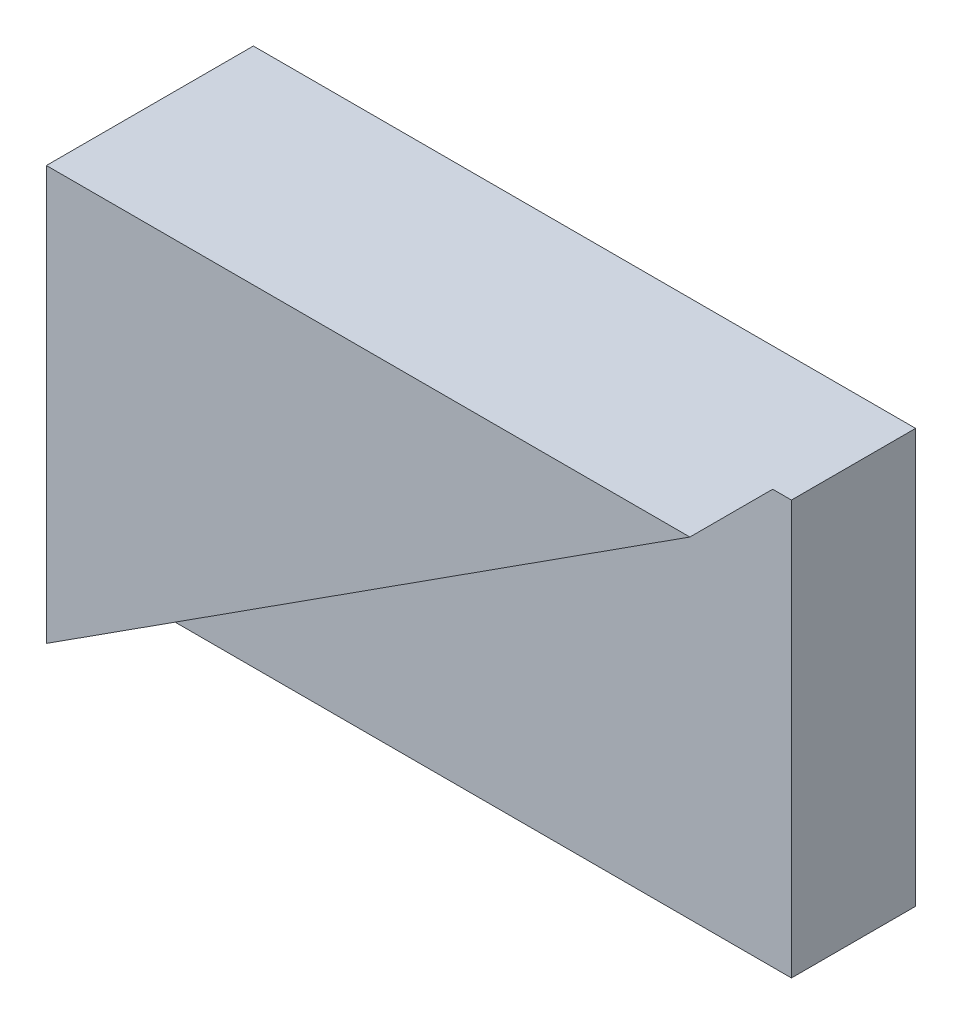
ISO-10303-21;
HEADER;
FILE_DESCRIPTION(('STEP AP214'),'2;1');
FILE_NAME('part.step','',(''),(''),'','','');
FILE_SCHEMA(('AUTOMOTIVE_DESIGN { 1 0 10303 214 1 1 1 1 }'));
ENDSEC;
DATA;
#1=APPLICATION_CONTEXT('core data for automotive mechanical design processes');
#2=APPLICATION_PROTOCOL_DEFINITION('international standard','automotive_design',2000,#1);
#3=PRODUCT_CONTEXT('',#1,'mechanical');
#4=PRODUCT('Part','Part','',(#3));
#5=PRODUCT_RELATED_PRODUCT_CATEGORY('part','',(#4));
#6=PRODUCT_DEFINITION_FORMATION('','',#4);
#7=PRODUCT_DEFINITION_CONTEXT('part definition',#1,'design');
#8=PRODUCT_DEFINITION('design','',#6,#7);
#9=PRODUCT_DEFINITION_SHAPE('','',#8);
#10=(LENGTH_UNIT() NAMED_UNIT(*) SI_UNIT(.MILLI.,.METRE.));
#11=(NAMED_UNIT(*) PLANE_ANGLE_UNIT() SI_UNIT($,.RADIAN.));
#12=(NAMED_UNIT(*) SI_UNIT($,.STERADIAN.) SOLID_ANGLE_UNIT());
#13=UNCERTAINTY_MEASURE_WITH_UNIT(LENGTH_MEASURE(1.E-05),#10,'distance_accuracy_value','');
#14=(GEOMETRIC_REPRESENTATION_CONTEXT(3) GLOBAL_UNCERTAINTY_ASSIGNED_CONTEXT((#13)) GLOBAL_UNIT_ASSIGNED_CONTEXT((#10,
#11,#12)) REPRESENTATION_CONTEXT('',''));
#15=CARTESIAN_POINT('',(0.,0.,0.));
#16=DIRECTION('',(0.,0.,1.));
#17=DIRECTION('',(1.,0.,0.));
#18=AXIS2_PLACEMENT_3D('',#15,#16,#17);
#19=CARTESIAN_POINT('',(0.,0.,5.));
#20=DIRECTION('',(1.,0.,0.));
#21=DIRECTION('',(0.,0.,-1.));
#22=AXIS2_PLACEMENT_3D('',#19,#20,#21);
#23=PLANE('',#22);
#24=DIRECTION('',(0.,-1.,0.));
#25=VECTOR('',#24,1.);
#26=CARTESIAN_POINT('',(0.,0.,0.));
#27=LINE('',#26,#25);
#28=CARTESIAN_POINT('',(0.,10.,0.));
#29=VERTEX_POINT('',#28);
#30=CARTESIAN_POINT('',(0.,0.,0.));
#31=VERTEX_POINT('',#30);
#32=EDGE_CURVE('E99',#29,#31,#27,.T.);
#33=ORIENTED_EDGE('',*,*,#32,.T.);
#34=DIRECTION('',(0.,0.,-1.));
#35=VECTOR('',#34,1.);
#36=CARTESIAN_POINT('',(0.,0.,5.));
#37=LINE('',#36,#35);
#38=CARTESIAN_POINT('',(0.,0.,3.));
#39=VERTEX_POINT('',#38);
#40=EDGE_CURVE('E107',#39,#31,#37,.T.);
#41=ORIENTED_EDGE('',*,*,#40,.F.);
#42=CARTESIAN_POINT('',(0.,0.,5.));
#43=VERTEX_POINT('',#42);
#44=EDGE_CURVE('E108',#43,#39,#37,.T.);
#45=ORIENTED_EDGE('',*,*,#44,.F.);
#46=DIRECTION('',(0.,-1.,0.));
#47=VECTOR('',#46,1.);
#48=CARTESIAN_POINT('',(0.,0.,5.));
#49=LINE('',#48,#47);
#50=CARTESIAN_POINT('',(0.,10.,5.));
#51=VERTEX_POINT('',#50);
#52=EDGE_CURVE('E100',#51,#43,#49,.T.);
#53=ORIENTED_EDGE('',*,*,#52,.F.);
#54=DIRECTION('',(0.,0.,-1.));
#55=VECTOR('',#54,1.);
#56=CARTESIAN_POINT('',(0.,10.,5.));
#57=LINE('',#56,#55);
#58=EDGE_CURVE('E85',#51,#29,#57,.T.);
#59=ORIENTED_EDGE('',*,*,#58,.T.);
#60=EDGE_LOOP('',(#33,#41,#45,#53,#59));
#61=FACE_BOUND('',#60,.T.);
#62=ADVANCED_FACE('F35',(#61),#23,.F.);
#63=CARTESIAN_POINT('',(0.,0.,5.));
#64=DIRECTION('',(0.,1.,0.));
#65=DIRECTION('',(0.,0.,1.));
#66=AXIS2_PLACEMENT_3D('',#63,#64,#65);
#67=PLANE('',#66);
#68=DIRECTION('',(0.,0.,-1.));
#69=VECTOR('',#68,1.);
#70=CARTESIAN_POINT('',(16.,0.,5.));
#71=LINE('',#70,#69);
#72=CARTESIAN_POINT('',(16.,0.,3.));
#73=VERTEX_POINT('',#72);
#74=CARTESIAN_POINT('',(16.,0.,0.));
#75=VERTEX_POINT('',#74);
#76=EDGE_CURVE('E84',#73,#75,#71,.T.);
#77=ORIENTED_EDGE('',*,*,#76,.F.);
#78=DIRECTION('',(1.,0.,0.));
#79=VECTOR('',#78,1.);
#80=CARTESIAN_POINT('',(0.,0.,3.));
#81=LINE('',#80,#79);
#82=EDGE_CURVE('E130',#39,#73,#81,.T.);
#83=ORIENTED_EDGE('',*,*,#82,.F.);
#84=ORIENTED_EDGE('',*,*,#40,.T.);
#85=DIRECTION('',(1.,0.,0.));
#86=VECTOR('',#85,1.);
#87=CARTESIAN_POINT('',(0.,0.,0.));
#88=LINE('',#87,#86);
#89=EDGE_CURVE('E94',#31,#75,#88,.T.);
#90=ORIENTED_EDGE('',*,*,#89,.T.);
#91=EDGE_LOOP('',(#77,#83,#84,#90));
#92=FACE_BOUND('',#91,.T.);
#93=ADVANCED_FACE('F118',(#92),#67,.F.);
#94=CARTESIAN_POINT('',(16.,0.,5.));
#95=DIRECTION('',(-1.,0.,0.));
#96=DIRECTION('',(0.,0.,1.));
#97=AXIS2_PLACEMENT_3D('',#94,#95,#96);
#98=PLANE('',#97);
#99=DIRECTION('',(0.,0.,-1.));
#100=VECTOR('',#99,1.);
#101=CARTESIAN_POINT('',(16.,10.,5.));
#102=LINE('',#101,#100);
#103=CARTESIAN_POINT('',(16.,10.,3.));
#104=VERTEX_POINT('',#103);
#105=CARTESIAN_POINT('',(16.,10.,0.));
#106=VERTEX_POINT('',#105);
#107=EDGE_CURVE('E74',#104,#106,#102,.T.);
#108=ORIENTED_EDGE('',*,*,#107,.F.);
#109=DIRECTION('',(0.,1.,0.));
#110=VECTOR('',#109,1.);
#111=CARTESIAN_POINT('',(16.,0.,3.));
#112=LINE('',#111,#110);
#113=EDGE_CURVE('E133',#73,#104,#112,.T.);
#114=ORIENTED_EDGE('',*,*,#113,.F.);
#115=ORIENTED_EDGE('',*,*,#76,.T.);
#116=DIRECTION('',(0.,1.,0.));
#117=VECTOR('',#116,1.);
#118=CARTESIAN_POINT('',(16.,0.,0.));
#119=LINE('',#118,#117);
#120=EDGE_CURVE('E88',#75,#106,#119,.T.);
#121=ORIENTED_EDGE('',*,*,#120,.T.);
#122=EDGE_LOOP('',(#108,#114,#115,#121));
#123=FACE_BOUND('',#122,.T.);
#124=ADVANCED_FACE('F89',(#123),#98,.F.);
#125=CARTESIAN_POINT('',(0.,10.,5.));
#126=DIRECTION('',(0.,-1.,0.));
#127=DIRECTION('',(0.,0.,-1.));
#128=AXIS2_PLACEMENT_3D('',#125,#126,#127);
#129=PLANE('',#128);
#130=DIRECTION('',(-1.,0.,0.));
#131=VECTOR('',#130,1.);
#132=CARTESIAN_POINT('',(0.,10.,5.));
#133=LINE('',#132,#131);
#134=CARTESIAN_POINT('',(15.5467412507954,10.,5.));
#135=VERTEX_POINT('',#134);
#136=EDGE_CURVE('E57',#135,#51,#133,.T.);
#137=ORIENTED_EDGE('',*,*,#136,.F.);
#138=DIRECTION('',(0.,0.,-1.));
#139=VECTOR('',#138,1.);
#140=CARTESIAN_POINT('',(15.5467412507954,10.,5.));
#141=LINE('',#140,#139);
#142=CARTESIAN_POINT('',(15.5467412507954,10.,3.));
#143=VERTEX_POINT('',#142);
#144=EDGE_CURVE('E49',#135,#143,#141,.T.);
#145=ORIENTED_EDGE('',*,*,#144,.T.);
#146=DIRECTION('',(1.,0.,0.));
#147=VECTOR('',#146,1.);
#148=CARTESIAN_POINT('',(0.,10.,3.));
#149=LINE('',#148,#147);
#150=EDGE_CURVE('E11',#143,#104,#149,.T.);
#151=ORIENTED_EDGE('',*,*,#150,.T.);
#152=ORIENTED_EDGE('',*,*,#107,.T.);
#153=DIRECTION('',(-1.,0.,0.));
#154=VECTOR('',#153,1.);
#155=CARTESIAN_POINT('',(0.,10.,0.));
#156=LINE('',#155,#154);
#157=EDGE_CURVE('E78',#106,#29,#156,.T.);
#158=ORIENTED_EDGE('',*,*,#157,.T.);
#159=ORIENTED_EDGE('',*,*,#58,.F.);
#160=EDGE_LOOP('',(#137,#145,#151,#152,#158,#159));
#161=FACE_BOUND('',#160,.T.);
#162=ADVANCED_FACE('F76',(#161),#129,.F.);
#163=CARTESIAN_POINT('',(0.,0.,5.));
#164=DIRECTION('',(0.,0.,-1.));
#165=DIRECTION('',(-1.,0.,0.));
#166=AXIS2_PLACEMENT_3D('',#163,#164,#165);
#167=PLANE('',#166);
#168=ORIENTED_EDGE('',*,*,#52,.T.);
#169=DIRECTION('',(0.841039012964396,0.540974471367989,0.));
#170=VECTOR('',#169,1.);
#171=CARTESIAN_POINT('',(0.,0.,5.));
#172=LINE('',#171,#170);
#173=EDGE_CURVE('E42',#43,#135,#172,.T.);
#174=ORIENTED_EDGE('',*,*,#173,.T.);
#175=ORIENTED_EDGE('',*,*,#136,.T.);
#176=EDGE_LOOP('',(#168,#174,#175));
#177=FACE_BOUND('',#176,.T.);
#178=ADVANCED_FACE('F110',(#177),#167,.F.);
#179=CARTESIAN_POINT('',(0.,0.,0.));
#180=DIRECTION('',(0.,0.,-1.));
#181=DIRECTION('',(-1.,0.,0.));
#182=AXIS2_PLACEMENT_3D('',#179,#180,#181);
#183=PLANE('',#182);
#184=ORIENTED_EDGE('',*,*,#32,.F.);
#185=ORIENTED_EDGE('',*,*,#157,.F.);
#186=ORIENTED_EDGE('',*,*,#120,.F.);
#187=ORIENTED_EDGE('',*,*,#89,.F.);
#188=EDGE_LOOP('',(#184,#185,#186,#187));
#189=FACE_BOUND('',#188,.T.);
#190=ADVANCED_FACE('F97',(#189),#183,.T.);
#191=CARTESIAN_POINT('',(0.,0.,3.));
#192=DIRECTION('',(0.,0.,-1.));
#193=DIRECTION('',(-1.,0.,0.));
#194=AXIS2_PLACEMENT_3D('',#191,#192,#193);
#195=PLANE('',#194);
#196=DIRECTION('',(-0.841039012964396,-0.540974471367989,0.));
#197=VECTOR('',#196,1.);
#198=CARTESIAN_POINT('',(16.,10.2915458242295,3.));
#199=LINE('',#198,#197);
#200=EDGE_CURVE('E127',#143,#39,#199,.T.);
#201=ORIENTED_EDGE('',*,*,#200,.T.);
#202=ORIENTED_EDGE('',*,*,#82,.T.);
#203=ORIENTED_EDGE('',*,*,#113,.T.);
#204=ORIENTED_EDGE('',*,*,#150,.F.);
#205=EDGE_LOOP('',(#201,#202,#203,#204));
#206=FACE_BOUND('',#205,.T.);
#207=ADVANCED_FACE('F137',(#206),#195,.F.);
#208=CARTESIAN_POINT('',(16.,10.2915458242295,3.));
#209=DIRECTION('',(-0.540974471367989,0.841039012964396,0.));
#210=DIRECTION('',(-0.841039012964396,-0.540974471367989,0.));
#211=AXIS2_PLACEMENT_3D('',#208,#209,#210);
#212=PLANE('',#211);
#213=ORIENTED_EDGE('',*,*,#173,.F.);
#214=ORIENTED_EDGE('',*,*,#44,.T.);
#215=ORIENTED_EDGE('',*,*,#200,.F.);
#216=ORIENTED_EDGE('',*,*,#144,.F.);
#217=EDGE_LOOP('',(#213,#214,#215,#216));
#218=FACE_BOUND('',#217,.T.);
#219=ADVANCED_FACE('F125',(#218),#212,.F.);
#220=CLOSED_SHELL('',(#62,#93,#124,#162,#178,#190,#207,#219));
#221=MANIFOLD_SOLID_BREP('B2',#220);
#222=ADVANCED_BREP_SHAPE_REPRESENTATION('',(#18,#221),#14);
#223=SHAPE_DEFINITION_REPRESENTATION(#9,#222);
ENDSEC;
END-ISO-10303-21;
